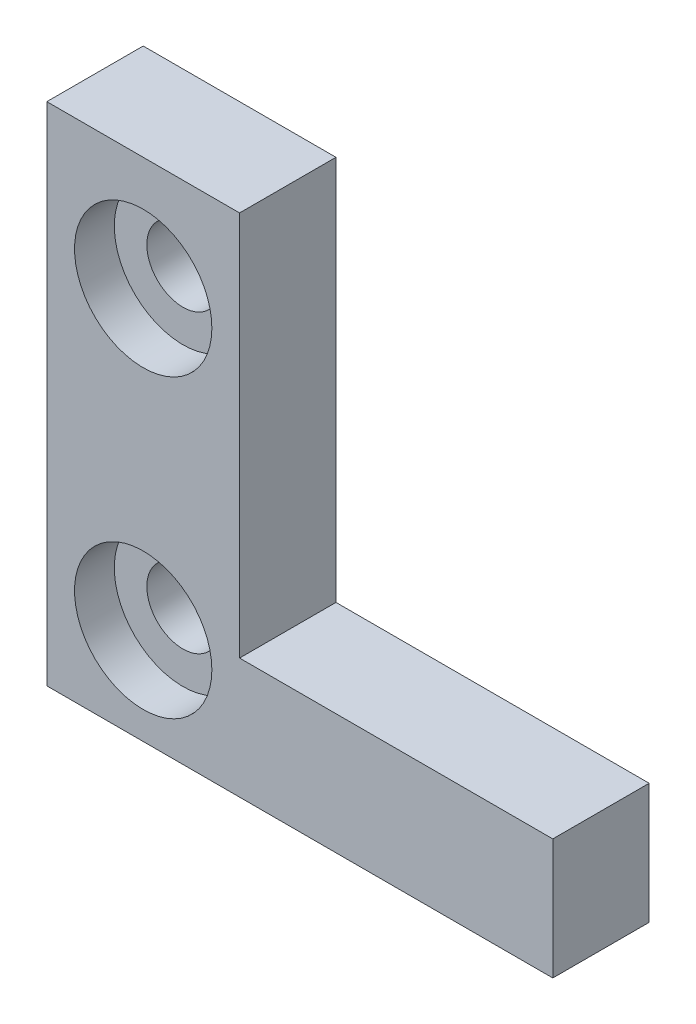
ISO-10303-21;
HEADER;
FILE_DESCRIPTION(('STEP AP214'),'2;1');
FILE_NAME('part.step','',(''),(''),'','','');
FILE_SCHEMA(('AUTOMOTIVE_DESIGN { 1 0 10303 214 1 1 1 1 }'));
ENDSEC;
DATA;
#1=APPLICATION_CONTEXT('core data for automotive mechanical design processes');
#2=APPLICATION_PROTOCOL_DEFINITION('international standard','automotive_design',2000,#1);
#3=PRODUCT_CONTEXT('',#1,'mechanical');
#4=PRODUCT('Part','Part','',(#3));
#5=PRODUCT_RELATED_PRODUCT_CATEGORY('part','',(#4));
#6=PRODUCT_DEFINITION_FORMATION('','',#4);
#7=PRODUCT_DEFINITION_CONTEXT('part definition',#1,'design');
#8=PRODUCT_DEFINITION('design','',#6,#7);
#9=PRODUCT_DEFINITION_SHAPE('','',#8);
#10=(LENGTH_UNIT() NAMED_UNIT(*) SI_UNIT(.MILLI.,.METRE.));
#11=(NAMED_UNIT(*) PLANE_ANGLE_UNIT() SI_UNIT($,.RADIAN.));
#12=(NAMED_UNIT(*) SI_UNIT($,.STERADIAN.) SOLID_ANGLE_UNIT());
#13=UNCERTAINTY_MEASURE_WITH_UNIT(LENGTH_MEASURE(1.E-05),#10,'distance_accuracy_value','');
#14=(GEOMETRIC_REPRESENTATION_CONTEXT(3) GLOBAL_UNCERTAINTY_ASSIGNED_CONTEXT((#13)) GLOBAL_UNIT_ASSIGNED_CONTEXT((#10,
#11,#12)) REPRESENTATION_CONTEXT('',''));
#15=CARTESIAN_POINT('',(0.,0.,0.));
#16=DIRECTION('',(0.,0.,1.));
#17=DIRECTION('',(1.,0.,0.));
#18=AXIS2_PLACEMENT_3D('',#15,#16,#17);
#19=CARTESIAN_POINT('',(0.999999999999991,-66.7150454034668,4.));
#20=DIRECTION('',(0.,0.,-1.));
#21=DIRECTION('',(-1.,0.,0.));
#22=AXIS2_PLACEMENT_3D('',#19,#20,#21);
#23=CYLINDRICAL_SURFACE('',#22,1.5);
#24=CARTESIAN_POINT('',(0.999999999999991,-66.7150454034668,0.));
#25=DIRECTION('',(0.,0.,1.));
#26=DIRECTION('',(1.,0.,0.));
#27=AXIS2_PLACEMENT_3D('',#24,#25,#26);
#28=CIRCLE('',#27,1.5);
#29=CARTESIAN_POINT('',(2.49999999999999,-66.7150454034668,0.));
#30=VERTEX_POINT('',#29);
#31=EDGE_CURVE('E148',#30,#30,#28,.T.);
#32=ORIENTED_EDGE('',*,*,#31,.F.);
#33=EDGE_LOOP('',(#32));
#34=FACE_BOUND('',#33,.T.);
#35=CARTESIAN_POINT('',(0.999999999999991,-66.7150454034668,2.35));
#36=DIRECTION('',(0.,0.,1.));
#37=DIRECTION('',(1.,0.,0.));
#38=AXIS2_PLACEMENT_3D('',#35,#36,#37);
#39=CIRCLE('',#38,1.5);
#40=CARTESIAN_POINT('',(2.49999999999999,-66.7150454034668,2.35));
#41=VERTEX_POINT('',#40);
#42=EDGE_CURVE('E39',#41,#41,#39,.T.);
#43=ORIENTED_EDGE('',*,*,#42,.T.);
#44=EDGE_LOOP('',(#43));
#45=FACE_BOUND('',#44,.T.);
#46=ADVANCED_FACE('F35',(#34,#45),#23,.F.);
#47=CARTESIAN_POINT('',(0.999999999999993,-79.0000000000002,4.));
#48=DIRECTION('',(0.,0.,-1.));
#49=DIRECTION('',(-1.,0.,0.));
#50=AXIS2_PLACEMENT_3D('',#47,#48,#49);
#51=CYLINDRICAL_SURFACE('',#50,1.5);
#52=CARTESIAN_POINT('',(0.999999999999993,-79.0000000000002,0.));
#53=DIRECTION('',(0.,0.,1.));
#54=DIRECTION('',(1.,0.,0.));
#55=AXIS2_PLACEMENT_3D('',#52,#53,#54);
#56=CIRCLE('',#55,1.5);
#57=CARTESIAN_POINT('',(2.49999999999999,-79.0000000000002,0.));
#58=VERTEX_POINT('',#57);
#59=EDGE_CURVE('E132',#58,#58,#56,.T.);
#60=ORIENTED_EDGE('',*,*,#59,.F.);
#61=EDGE_LOOP('',(#60));
#62=FACE_BOUND('',#61,.T.);
#63=CARTESIAN_POINT('',(0.999999999999993,-79.0000000000002,2.35));
#64=DIRECTION('',(0.,0.,1.));
#65=DIRECTION('',(1.,0.,0.));
#66=AXIS2_PLACEMENT_3D('',#63,#64,#65);
#67=CIRCLE('',#66,1.5);
#68=CARTESIAN_POINT('',(2.49999999999999,-79.0000000000002,2.35));
#69=VERTEX_POINT('',#68);
#70=EDGE_CURVE('E121',#69,#69,#67,.T.);
#71=ORIENTED_EDGE('',*,*,#70,.T.);
#72=EDGE_LOOP('',(#71));
#73=FACE_BOUND('',#72,.T.);
#74=ADVANCED_FACE('F189',(#62,#73),#51,.F.);
#75=CARTESIAN_POINT('',(4.99999999999999,0.,4.));
#76=DIRECTION('',(-1.,0.,0.));
#77=DIRECTION('',(0.,0.,1.));
#78=AXIS2_PLACEMENT_3D('',#75,#76,#77);
#79=PLANE('',#78);
#80=DIRECTION('',(0.,1.,0.));
#81=VECTOR('',#80,1.);
#82=CARTESIAN_POINT('',(4.99999999999999,0.,0.));
#83=LINE('',#82,#81);
#84=CARTESIAN_POINT('',(4.99999999999999,-78.0000000000002,0.));
#85=VERTEX_POINT('',#84);
#86=CARTESIAN_POINT('',(4.99999999999999,-62.0000000000002,0.));
#87=VERTEX_POINT('',#86);
#88=EDGE_CURVE('E98',#85,#87,#83,.T.);
#89=ORIENTED_EDGE('',*,*,#88,.T.);
#90=DIRECTION('',(0.,0.,-1.));
#91=VECTOR('',#90,1.);
#92=CARTESIAN_POINT('',(4.99999999999999,-62.0000000000002,4.));
#93=LINE('',#92,#91);
#94=CARTESIAN_POINT('',(4.99999999999999,-62.0000000000002,4.));
#95=VERTEX_POINT('',#94);
#96=EDGE_CURVE('E11',#95,#87,#93,.T.);
#97=ORIENTED_EDGE('',*,*,#96,.F.);
#98=DIRECTION('',(0.,1.,0.));
#99=VECTOR('',#98,1.);
#100=CARTESIAN_POINT('',(4.99999999999999,0.,4.));
#101=LINE('',#100,#99);
#102=CARTESIAN_POINT('',(4.99999999999999,-78.0000000000002,4.));
#103=VERTEX_POINT('',#102);
#104=EDGE_CURVE('E89',#103,#95,#101,.T.);
#105=ORIENTED_EDGE('',*,*,#104,.F.);
#106=DIRECTION('',(0.,0.,-1.));
#107=VECTOR('',#106,1.);
#108=CARTESIAN_POINT('',(4.99999999999999,-78.0000000000002,4.));
#109=LINE('',#108,#107);
#110=EDGE_CURVE('E110',#103,#85,#109,.T.);
#111=ORIENTED_EDGE('',*,*,#110,.T.);
#112=EDGE_LOOP('',(#89,#97,#105,#111));
#113=FACE_BOUND('',#112,.T.);
#114=ADVANCED_FACE('F37',(#113),#79,.F.);
#115=CARTESIAN_POINT('',(0.,-62.0000000000002,4.));
#116=DIRECTION('',(0.,-1.,0.));
#117=DIRECTION('',(0.,0.,-1.));
#118=AXIS2_PLACEMENT_3D('',#115,#116,#117);
#119=PLANE('',#118);
#120=DIRECTION('',(-1.,0.,0.));
#121=VECTOR('',#120,1.);
#122=CARTESIAN_POINT('',(0.,-62.0000000000002,0.));
#123=LINE('',#122,#121);
#124=CARTESIAN_POINT('',(-3.00000000000001,-62.0000000000002,0.));
#125=VERTEX_POINT('',#124);
#126=EDGE_CURVE('E104',#87,#125,#123,.T.);
#127=ORIENTED_EDGE('',*,*,#126,.T.);
#128=DIRECTION('',(0.,0.,-1.));
#129=VECTOR('',#128,1.);
#130=CARTESIAN_POINT('',(-3.00000000000001,-62.0000000000002,4.));
#131=LINE('',#130,#129);
#132=CARTESIAN_POINT('',(-3.00000000000001,-62.0000000000002,4.));
#133=VERTEX_POINT('',#132);
#134=EDGE_CURVE('E44',#133,#125,#131,.T.);
#135=ORIENTED_EDGE('',*,*,#134,.F.);
#136=DIRECTION('',(-1.,0.,0.));
#137=VECTOR('',#136,1.);
#138=CARTESIAN_POINT('',(0.,-62.0000000000002,4.));
#139=LINE('',#138,#137);
#140=EDGE_CURVE('E131',#95,#133,#139,.T.);
#141=ORIENTED_EDGE('',*,*,#140,.F.);
#142=ORIENTED_EDGE('',*,*,#96,.T.);
#143=EDGE_LOOP('',(#127,#135,#141,#142));
#144=FACE_BOUND('',#143,.T.);
#145=ADVANCED_FACE('F204',(#144),#119,.F.);
#146=CARTESIAN_POINT('',(-3.00000000000001,0.,4.));
#147=DIRECTION('',(-1.,0.,0.));
#148=DIRECTION('',(0.,0.,1.));
#149=AXIS2_PLACEMENT_3D('',#146,#147,#148);
#150=PLANE('',#149);
#151=DIRECTION('',(0.,1.,0.));
#152=VECTOR('',#151,1.);
#153=CARTESIAN_POINT('',(-3.00000000000001,0.,0.));
#154=LINE('',#153,#152);
#155=CARTESIAN_POINT('',(-3.00000000000001,-83.0000000000002,0.));
#156=VERTEX_POINT('',#155);
#157=EDGE_CURVE('E142',#156,#125,#154,.T.);
#158=ORIENTED_EDGE('',*,*,#157,.F.);
#159=DIRECTION('',(0.,0.,-1.));
#160=VECTOR('',#159,1.);
#161=CARTESIAN_POINT('',(-3.00000000000001,-83.0000000000002,4.));
#162=LINE('',#161,#160);
#163=CARTESIAN_POINT('',(-3.00000000000001,-83.0000000000002,4.));
#164=VERTEX_POINT('',#163);
#165=EDGE_CURVE('E154',#164,#156,#162,.T.);
#166=ORIENTED_EDGE('',*,*,#165,.F.);
#167=DIRECTION('',(0.,1.,0.));
#168=VECTOR('',#167,1.);
#169=CARTESIAN_POINT('',(-3.00000000000001,0.,4.));
#170=LINE('',#169,#168);
#171=EDGE_CURVE('E134',#164,#133,#170,.T.);
#172=ORIENTED_EDGE('',*,*,#171,.T.);
#173=ORIENTED_EDGE('',*,*,#134,.T.);
#174=EDGE_LOOP('',(#158,#166,#172,#173));
#175=FACE_BOUND('',#174,.T.);
#176=ADVANCED_FACE('F201',(#175),#150,.T.);
#177=CARTESIAN_POINT('',(0.,-83.0000000000002,4.));
#178=DIRECTION('',(0.,1.,0.));
#179=DIRECTION('',(0.,0.,1.));
#180=AXIS2_PLACEMENT_3D('',#177,#178,#179);
#181=PLANE('',#180);
#182=DIRECTION('',(1.,0.,0.));
#183=VECTOR('',#182,1.);
#184=CARTESIAN_POINT('',(0.,-83.0000000000002,0.));
#185=LINE('',#184,#183);
#186=CARTESIAN_POINT('',(18.,-83.0000000000002,0.));
#187=VERTEX_POINT('',#186);
#188=EDGE_CURVE('E144',#156,#187,#185,.T.);
#189=ORIENTED_EDGE('',*,*,#188,.T.);
#190=DIRECTION('',(0.,0.,-1.));
#191=VECTOR('',#190,1.);
#192=CARTESIAN_POINT('',(18.,-83.0000000000002,4.));
#193=LINE('',#192,#191);
#194=CARTESIAN_POINT('',(18.,-83.0000000000002,4.));
#195=VERTEX_POINT('',#194);
#196=EDGE_CURVE('E139',#195,#187,#193,.T.);
#197=ORIENTED_EDGE('',*,*,#196,.F.);
#198=DIRECTION('',(1.,0.,0.));
#199=VECTOR('',#198,1.);
#200=CARTESIAN_POINT('',(0.,-83.0000000000002,4.));
#201=LINE('',#200,#199);
#202=EDGE_CURVE('E137',#164,#195,#201,.T.);
#203=ORIENTED_EDGE('',*,*,#202,.F.);
#204=ORIENTED_EDGE('',*,*,#165,.T.);
#205=EDGE_LOOP('',(#189,#197,#203,#204));
#206=FACE_BOUND('',#205,.T.);
#207=ADVANCED_FACE('F185',(#206),#181,.F.);
#208=CARTESIAN_POINT('',(18.,0.,4.));
#209=DIRECTION('',(1.,0.,0.));
#210=DIRECTION('',(0.,0.,-1.));
#211=AXIS2_PLACEMENT_3D('',#208,#209,#210);
#212=PLANE('',#211);
#213=DIRECTION('',(0.,0.,-1.));
#214=VECTOR('',#213,1.);
#215=CARTESIAN_POINT('',(18.,-78.0000000000002,4.));
#216=LINE('',#215,#214);
#217=CARTESIAN_POINT('',(18.,-78.0000000000002,4.));
#218=VERTEX_POINT('',#217);
#219=CARTESIAN_POINT('',(18.,-78.0000000000002,0.));
#220=VERTEX_POINT('',#219);
#221=EDGE_CURVE('E52',#218,#220,#216,.T.);
#222=ORIENTED_EDGE('',*,*,#221,.F.);
#223=DIRECTION('',(0.,-1.,0.));
#224=VECTOR('',#223,1.);
#225=CARTESIAN_POINT('',(18.,0.,4.));
#226=LINE('',#225,#224);
#227=EDGE_CURVE('E60',#218,#195,#226,.T.);
#228=ORIENTED_EDGE('',*,*,#227,.T.);
#229=ORIENTED_EDGE('',*,*,#196,.T.);
#230=DIRECTION('',(0.,-1.,0.));
#231=VECTOR('',#230,1.);
#232=CARTESIAN_POINT('',(18.,0.,0.));
#233=LINE('',#232,#231);
#234=EDGE_CURVE('E82',#220,#187,#233,.T.);
#235=ORIENTED_EDGE('',*,*,#234,.F.);
#236=EDGE_LOOP('',(#222,#228,#229,#235));
#237=FACE_BOUND('',#236,.T.);
#238=ADVANCED_FACE('F178',(#237),#212,.T.);
#239=CARTESIAN_POINT('',(0.,0.,4.));
#240=DIRECTION('',(0.,0.,1.));
#241=DIRECTION('',(1.,0.,0.));
#242=AXIS2_PLACEMENT_3D('',#239,#240,#241);
#243=PLANE('',#242);
#244=DIRECTION('',(1.,0.,0.));
#245=VECTOR('',#244,1.);
#246=CARTESIAN_POINT('',(0.,-78.0000000000002,4.));
#247=LINE('',#246,#245);
#248=EDGE_CURVE('E111',#103,#218,#247,.T.);
#249=ORIENTED_EDGE('',*,*,#248,.F.);
#250=ORIENTED_EDGE('',*,*,#104,.T.);
#251=ORIENTED_EDGE('',*,*,#140,.T.);
#252=ORIENTED_EDGE('',*,*,#171,.F.);
#253=ORIENTED_EDGE('',*,*,#202,.T.);
#254=ORIENTED_EDGE('',*,*,#227,.F.);
#255=EDGE_LOOP('',(#249,#250,#251,#252,#253,#254));
#256=FACE_BOUND('',#255,.T.);
#257=CARTESIAN_POINT('',(0.999999999999993,-79.0000000000002,4.));
#258=DIRECTION('',(0.,0.,1.));
#259=DIRECTION('',(1.,0.,0.));
#260=AXIS2_PLACEMENT_3D('',#257,#258,#259);
#261=CIRCLE('',#260,2.85);
#262=CARTESIAN_POINT('',(3.84999999999999,-79.0000000000002,4.));
#263=VERTEX_POINT('',#262);
#264=EDGE_CURVE('E122',#263,#263,#261,.T.);
#265=ORIENTED_EDGE('',*,*,#264,.F.);
#266=EDGE_LOOP('',(#265));
#267=FACE_BOUND('',#266,.T.);
#268=CARTESIAN_POINT('',(0.999999999999991,-66.7150454034668,4.));
#269=DIRECTION('',(0.,0.,1.));
#270=DIRECTION('',(1.,0.,0.));
#271=AXIS2_PLACEMENT_3D('',#268,#269,#270);
#272=CIRCLE('',#271,2.85);
#273=CARTESIAN_POINT('',(3.84999999999999,-66.7150454034668,4.));
#274=VERTEX_POINT('',#273);
#275=EDGE_CURVE('E117',#274,#274,#272,.T.);
#276=ORIENTED_EDGE('',*,*,#275,.F.);
#277=EDGE_LOOP('',(#276));
#278=FACE_BOUND('',#277,.T.);
#279=ADVANCED_FACE('F176',(#256,#267,#278),#243,.T.);
#280=CARTESIAN_POINT('',(0.,0.,0.));
#281=DIRECTION('',(0.,0.,1.));
#282=DIRECTION('',(1.,0.,0.));
#283=AXIS2_PLACEMENT_3D('',#280,#281,#282);
#284=PLANE('',#283);
#285=ORIENTED_EDGE('',*,*,#88,.F.);
#286=DIRECTION('',(1.,0.,0.));
#287=VECTOR('',#286,1.);
#288=CARTESIAN_POINT('',(0.,-78.0000000000002,0.));
#289=LINE('',#288,#287);
#290=EDGE_CURVE('E101',#85,#220,#289,.T.);
#291=ORIENTED_EDGE('',*,*,#290,.T.);
#292=ORIENTED_EDGE('',*,*,#234,.T.);
#293=ORIENTED_EDGE('',*,*,#188,.F.);
#294=ORIENTED_EDGE('',*,*,#157,.T.);
#295=ORIENTED_EDGE('',*,*,#126,.F.);
#296=EDGE_LOOP('',(#285,#291,#292,#293,#294,#295));
#297=FACE_BOUND('',#296,.T.);
#298=ORIENTED_EDGE('',*,*,#31,.T.);
#299=EDGE_LOOP('',(#298));
#300=FACE_BOUND('',#299,.T.);
#301=ORIENTED_EDGE('',*,*,#59,.T.);
#302=EDGE_LOOP('',(#301));
#303=FACE_BOUND('',#302,.T.);
#304=ADVANCED_FACE('F99',(#297,#300,#303),#284,.F.);
#305=CARTESIAN_POINT('',(0.999999999999991,-66.7150454034668,2.35));
#306=DIRECTION('',(0.,0.,1.));
#307=DIRECTION('',(1.,0.,0.));
#308=AXIS2_PLACEMENT_3D('',#305,#306,#307);
#309=CYLINDRICAL_SURFACE('',#308,2.85);
#310=CARTESIAN_POINT('',(0.999999999999991,-66.7150454034668,2.35));
#311=DIRECTION('',(0.,0.,1.));
#312=DIRECTION('',(1.,0.,0.));
#313=AXIS2_PLACEMENT_3D('',#310,#311,#312);
#314=CIRCLE('',#313,2.85);
#315=CARTESIAN_POINT('',(3.84999999999999,-66.7150454034668,2.35));
#316=VERTEX_POINT('',#315);
#317=EDGE_CURVE('E125',#316,#316,#314,.T.);
#318=ORIENTED_EDGE('',*,*,#317,.F.);
#319=EDGE_LOOP('',(#318));
#320=FACE_BOUND('',#319,.T.);
#321=ORIENTED_EDGE('',*,*,#275,.T.);
#322=EDGE_LOOP('',(#321));
#323=FACE_BOUND('',#322,.T.);
#324=ADVANCED_FACE('F167',(#320,#323),#309,.F.);
#325=CARTESIAN_POINT('',(0.999999999999991,-66.7150454034668,2.35));
#326=DIRECTION('',(0.,0.,1.));
#327=DIRECTION('',(1.,0.,0.));
#328=AXIS2_PLACEMENT_3D('',#325,#326,#327);
#329=PLANE('',#328);
#330=ORIENTED_EDGE('',*,*,#42,.F.);
#331=EDGE_LOOP('',(#330));
#332=FACE_BOUND('',#331,.T.);
#333=ORIENTED_EDGE('',*,*,#317,.T.);
#334=EDGE_LOOP('',(#333));
#335=FACE_BOUND('',#334,.T.);
#336=ADVANCED_FACE('F163',(#332,#335),#329,.T.);
#337=CARTESIAN_POINT('',(0.999999999999993,-79.0000000000002,2.35));
#338=DIRECTION('',(0.,0.,1.));
#339=DIRECTION('',(1.,0.,0.));
#340=AXIS2_PLACEMENT_3D('',#337,#338,#339);
#341=CYLINDRICAL_SURFACE('',#340,2.85);
#342=CARTESIAN_POINT('',(0.999999999999993,-79.0000000000002,2.35));
#343=DIRECTION('',(0.,0.,1.));
#344=DIRECTION('',(1.,0.,0.));
#345=AXIS2_PLACEMENT_3D('',#342,#343,#344);
#346=CIRCLE('',#345,2.85);
#347=CARTESIAN_POINT('',(3.84999999999999,-79.0000000000002,2.35));
#348=VERTEX_POINT('',#347);
#349=EDGE_CURVE('E118',#348,#348,#346,.T.);
#350=ORIENTED_EDGE('',*,*,#349,.F.);
#351=EDGE_LOOP('',(#350));
#352=FACE_BOUND('',#351,.T.);
#353=ORIENTED_EDGE('',*,*,#264,.T.);
#354=EDGE_LOOP('',(#353));
#355=FACE_BOUND('',#354,.T.);
#356=ADVANCED_FACE('F166',(#352,#355),#341,.F.);
#357=CARTESIAN_POINT('',(0.999999999999993,-79.0000000000002,2.35));
#358=DIRECTION('',(0.,0.,1.));
#359=DIRECTION('',(1.,0.,0.));
#360=AXIS2_PLACEMENT_3D('',#357,#358,#359);
#361=PLANE('',#360);
#362=ORIENTED_EDGE('',*,*,#70,.F.);
#363=EDGE_LOOP('',(#362));
#364=FACE_BOUND('',#363,.T.);
#365=ORIENTED_EDGE('',*,*,#349,.T.);
#366=EDGE_LOOP('',(#365));
#367=FACE_BOUND('',#366,.T.);
#368=ADVANCED_FACE('F249',(#364,#367),#361,.T.);
#369=CARTESIAN_POINT('',(0.,-78.0000000000002,4.));
#370=DIRECTION('',(0.,-1.,0.));
#371=DIRECTION('',(0.,0.,-1.));
#372=AXIS2_PLACEMENT_3D('',#369,#370,#371);
#373=PLANE('',#372);
#374=ORIENTED_EDGE('',*,*,#248,.T.);
#375=ORIENTED_EDGE('',*,*,#221,.T.);
#376=ORIENTED_EDGE('',*,*,#290,.F.);
#377=ORIENTED_EDGE('',*,*,#110,.F.);
#378=EDGE_LOOP('',(#374,#375,#376,#377));
#379=FACE_BOUND('',#378,.T.);
#380=ADVANCED_FACE('F109',(#379),#373,.F.);
#381=CLOSED_SHELL('',(#46,#74,#114,#145,#176,#207,#238,#279,#304,#324,#336,#356,#368,#380));
#382=MANIFOLD_SOLID_BREP('B2',#381);
#383=ADVANCED_BREP_SHAPE_REPRESENTATION('',(#18,#382),#14);
#384=SHAPE_DEFINITION_REPRESENTATION(#9,#383);
ENDSEC;
END-ISO-10303-21;
